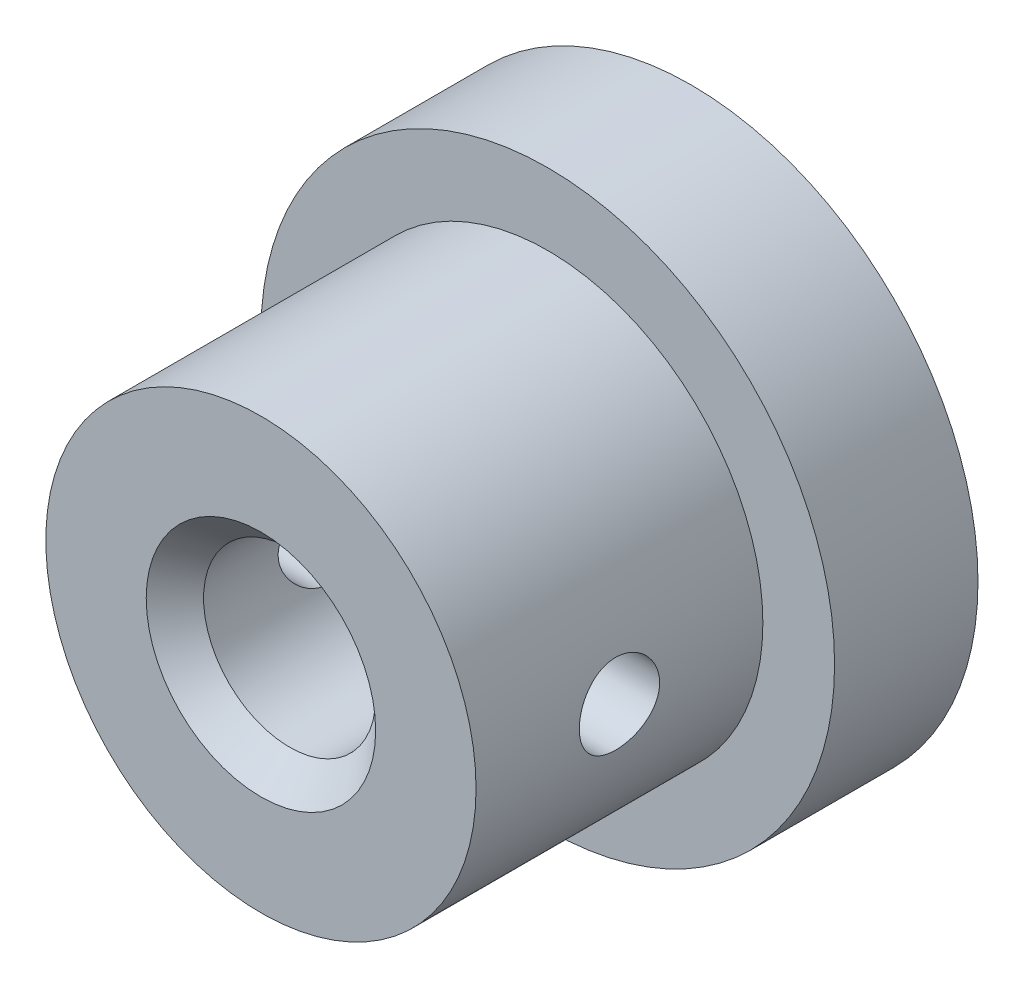
ISO-10303-21;
HEADER;
FILE_DESCRIPTION(('STEP AP214'),'2;1');
FILE_NAME('part.step','',(''),(''),'','','');
FILE_SCHEMA(('AUTOMOTIVE_DESIGN { 1 0 10303 214 1 1 1 1 }'));
ENDSEC;
DATA;
#1=APPLICATION_CONTEXT('core data for automotive mechanical design processes');
#2=APPLICATION_PROTOCOL_DEFINITION('international standard','automotive_design',2000,#1);
#3=PRODUCT_CONTEXT('',#1,'mechanical');
#4=PRODUCT('Part','Part','',(#3));
#5=PRODUCT_RELATED_PRODUCT_CATEGORY('part','',(#4));
#6=PRODUCT_DEFINITION_FORMATION('','',#4);
#7=PRODUCT_DEFINITION_CONTEXT('part definition',#1,'design');
#8=PRODUCT_DEFINITION('design','',#6,#7);
#9=PRODUCT_DEFINITION_SHAPE('','',#8);
#10=(LENGTH_UNIT() NAMED_UNIT(*) SI_UNIT(.MILLI.,.METRE.));
#11=(NAMED_UNIT(*) PLANE_ANGLE_UNIT() SI_UNIT($,.RADIAN.));
#12=(NAMED_UNIT(*) SI_UNIT($,.STERADIAN.) SOLID_ANGLE_UNIT());
#13=UNCERTAINTY_MEASURE_WITH_UNIT(LENGTH_MEASURE(1.E-05),#10,'distance_accuracy_value','');
#14=(GEOMETRIC_REPRESENTATION_CONTEXT(3) GLOBAL_UNCERTAINTY_ASSIGNED_CONTEXT((#13)) GLOBAL_UNIT_ASSIGNED_CONTEXT((#10,
#11,#12)) REPRESENTATION_CONTEXT('',''));
#15=CARTESIAN_POINT('',(0.,0.,0.));
#16=DIRECTION('',(0.,0.,1.));
#17=DIRECTION('',(1.,0.,0.));
#18=AXIS2_PLACEMENT_3D('',#15,#16,#17);
#19=CARTESIAN_POINT('',(0.,0.,15.));
#20=DIRECTION('',(0.,0.,-1.));
#21=DIRECTION('',(-1.,0.,0.));
#22=AXIS2_PLACEMENT_3D('',#19,#20,#21);
#23=CYLINDRICAL_SURFACE('',#22,3.);
#24=CARTESIAN_POINT('',(0.,0.,14.));
#25=DIRECTION('',(0.,0.,1.));
#26=DIRECTION('',(1.,0.,0.));
#27=AXIS2_PLACEMENT_3D('',#24,#25,#26);
#28=CIRCLE('',#27,3.);
#29=CARTESIAN_POINT('',(3.,0.,14.));
#30=VERTEX_POINT('',#29);
#31=EDGE_CURVE('E44',#30,#30,#28,.T.);
#32=ORIENTED_EDGE('',*,*,#31,.T.);
#33=EDGE_LOOP('',(#32));
#34=FACE_BOUND('',#33,.T.);
#35=CARTESIAN_POINT('',(0.,0.,0.999999999999996));
#36=DIRECTION('',(0.,0.,1.));
#37=DIRECTION('',(1.,0.,0.));
#38=AXIS2_PLACEMENT_3D('',#35,#36,#37);
#39=CIRCLE('',#38,3.);
#40=CARTESIAN_POINT('',(3.,0.,0.999999999999996));
#41=VERTEX_POINT('',#40);
#42=EDGE_CURVE('E48',#41,#41,#39,.F.);
#43=ORIENTED_EDGE('',*,*,#42,.T.);
#44=EDGE_LOOP('',(#43));
#45=FACE_BOUND('',#44,.T.);
#46=CARTESIAN_POINT('',(-3.,0.,11.4));
#47=CARTESIAN_POINT('',(-2.9999965985567,-0.0741760141958528,11.3999959494459));
#48=CARTESIAN_POINT('',(-2.99721866421499,-0.148457438343158,11.3940701791647));
#49=CARTESIAN_POINT('',(-2.98638133101226,-0.294860958042638,11.3706122407267));
#50=CARTESIAN_POINT('',(-2.97831023303417,-0.36697789948566,11.353054362039));
#51=CARTESIAN_POINT('',(-2.95773878056305,-0.506705207958353,11.3071482448661));
#52=CARTESIAN_POINT('',(-2.94525483671525,-0.574331184032726,11.2788399567657));
#53=CARTESIAN_POINT('',(-2.91703179641225,-0.703790652559755,11.2124256993013));
#54=CARTESIAN_POINT('',(-2.90129324579851,-0.765625113804206,11.1743213726048));
#55=CARTESIAN_POINT('',(-2.86703510505487,-0.885556018232678,11.0870093163225));
#56=CARTESIAN_POINT('',(-2.84841047078529,-0.943262854198594,11.0373081607334));
#57=CARTESIAN_POINT('',(-2.81086626705386,-1.04987206669058,10.9292658128459));
#58=CARTESIAN_POINT('',(-2.79194651225135,-1.09876864666266,10.8709189779387));
#59=CARTESIAN_POINT('',(-2.75454886272565,-1.18954928643585,10.7426563277008));
#60=CARTESIAN_POINT('',(-2.73618026181933,-1.23076801131511,10.6722341734925));
#61=CARTESIAN_POINT('',(-2.70368671328044,-1.30060459631541,10.5244916658338));
#62=CARTESIAN_POINT('',(-2.68955905843085,-1.32923050054668,10.447175754093));
#63=CARTESIAN_POINT('',(-2.66831280778357,-1.37136389166292,10.2922913308142));
#64=CARTESIAN_POINT('',(-2.66084688805232,-1.38562630954338,10.2149779866021));
#65=CARTESIAN_POINT('',(-2.65280653141493,-1.4009643178012,10.0587238445313));
#66=CARTESIAN_POINT('',(-2.65222672171534,-1.40205018901381,9.97978436362684));
#67=CARTESIAN_POINT('',(-2.6577381391041,-1.39156325474428,9.83104782259268));
#68=CARTESIAN_POINT('',(-2.66316277668237,-1.38125548710099,9.76113132367479));
#69=CARTESIAN_POINT('',(-2.67892103840313,-1.35043639237287,9.62416592160718));
#70=CARTESIAN_POINT('',(-2.68925592410991,-1.32992244300339,9.55711776023274));
#71=CARTESIAN_POINT('',(-2.71390923378543,-1.27887161255287,9.42592780866886));
#72=CARTESIAN_POINT('',(-2.7283140240837,-1.24811450695909,9.36188869599852));
#73=CARTESIAN_POINT('',(-2.75947702819645,-1.17761205733664,9.23959400364931));
#74=CARTESIAN_POINT('',(-2.77623626923161,-1.13786278548149,9.18134096740935));
#75=CARTESIAN_POINT('',(-2.81242518177222,-1.04545769592097,9.06561325724133));
#76=CARTESIAN_POINT('',(-2.83194722846672,-0.991869135627384,9.00890981132952));
#77=CARTESIAN_POINT('',(-2.86996272516678,-0.875809338201001,8.90499883889947));
#78=CARTESIAN_POINT('',(-2.88845579691007,-0.813334864133947,8.85779478799144));
#79=CARTESIAN_POINT('',(-2.92314231667083,-0.678420066791913,8.77267474199008));
#80=CARTESIAN_POINT('',(-2.9392303997136,-0.605704043903012,8.73514943953424));
#81=CARTESIAN_POINT('',(-2.9664385628126,-0.454047875045108,8.67314728148889));
#82=CARTESIAN_POINT('',(-2.97756209480586,-0.375112098848908,8.64866135710182));
#83=CARTESIAN_POINT('',(-2.99289168727817,-0.219630179590067,8.61522461451369));
#84=CARTESIAN_POINT('',(-2.99755511855446,-0.143350867486892,8.60524384224663));
#85=CARTESIAN_POINT('',(-3.00096130674055,0.0099315960306232,8.59793666008045));
#86=CARTESIAN_POINT('',(-2.99970636153703,0.0869344549310015,8.60060533886939));
#87=CARTESIAN_POINT('',(-2.99169876992405,0.234138662301143,8.61785977225628));
#88=CARTESIAN_POINT('',(-2.98531143610107,0.304455247280259,8.63165387927403));
#89=CARTESIAN_POINT('',(-2.9681169868393,0.441661374952194,8.66958529647006));
#90=CARTESIAN_POINT('',(-2.95730935403885,0.508550515457679,8.69372381739748));
#91=CARTESIAN_POINT('',(-2.93186182190093,0.639346310572955,8.75238939988832));
#92=CARTESIAN_POINT('',(-2.91711463217099,0.703098749779364,8.78721214998557));
#93=CARTESIAN_POINT('',(-2.88527461622476,0.824081336424184,8.86593442705303));
#94=CARTESIAN_POINT('',(-2.86818076040266,0.881308600637788,8.90983794254021));
#95=CARTESIAN_POINT('',(-2.83157928041133,0.992927203863402,9.00995057808187));
#96=CARTESIAN_POINT('',(-2.81199150907127,1.04662821994276,9.06690174669527));
#97=CARTESIAN_POINT('',(-2.77381712049361,1.14397488618523,9.18917794714694));
#98=CARTESIAN_POINT('',(-2.7552309844915,1.18761573536872,9.25450695406383));
#99=CARTESIAN_POINT('',(-2.72065279755535,1.26487258942863,9.3944537387633));
#100=CARTESIAN_POINT('',(-2.70476441122083,1.29811762077689,9.4693040329686));
#101=CARTESIAN_POINT('',(-2.67864935946574,1.35119476914698,9.62452606229619));
#102=CARTESIAN_POINT('',(-2.6684164320798,1.37104172650418,9.70489157939703));
#103=CARTESIAN_POINT('',(-2.65589863089785,1.39512361569359,9.86107554771441));
#104=CARTESIAN_POINT('',(-2.65298045006346,1.40060458275625,9.93665086073106));
#105=CARTESIAN_POINT('',(-2.65367487263324,1.39928993042139,10.08765382327));
#106=CARTESIAN_POINT('',(-2.65728564169681,1.39249775922279,10.1630815083089));
#107=CARTESIAN_POINT('',(-2.66999487603889,1.36795238910771,10.3059000624837));
#108=CARTESIAN_POINT('',(-2.67867409395688,1.35103435582631,10.3734759592958));
#109=CARTESIAN_POINT('',(-2.70011439829818,1.30765598987226,10.5047982846028));
#110=CARTESIAN_POINT('',(-2.71287670048705,1.28119281477063,10.5685435657827));
#111=CARTESIAN_POINT('',(-2.74208602331761,1.21748406199402,10.6950365450524));
#112=CARTESIAN_POINT('',(-2.75872111955289,1.1796403806501,10.7574384776214));
#113=CARTESIAN_POINT('',(-2.79340714138716,1.0949742620724,10.8753898144412));
#114=CARTESIAN_POINT('',(-2.81145872568485,1.04814763276814,10.9309359993539));
#115=CARTESIAN_POINT('',(-2.8491150891186,0.94130768052003,11.0393736199957));
#116=CARTESIAN_POINT('',(-2.86869394428718,0.880442612871033,11.0914392587178));
#117=CARTESIAN_POINT('',(-2.90547332461736,0.750199086477078,11.1847434328512));
#118=CARTESIAN_POINT('',(-2.92267271652822,0.680816600685454,11.2259768176048));
#119=CARTESIAN_POINT('',(-2.95272548252543,0.535611024288785,11.2959874979833));
#120=CARTESIAN_POINT('',(-2.96560157678301,0.45982430997794,11.3248301416636));
#121=CARTESIAN_POINT('',(-2.98560363061672,0.303822742627248,11.3690227435493));
#122=CARTESIAN_POINT('',(-2.99274669700571,0.223621832238214,11.3844128551744));
#123=CARTESIAN_POINT('',(-2.99773444736987,0.118989792805176,11.3951390145757));
#124=CARTESIAN_POINT('',(-2.99858232619917,0.0952397688918327,11.3969599000192));
#125=CARTESIAN_POINT('',(-2.99971565466794,0.0476634596251051,11.39939105565));
#126=CARTESIAN_POINT('',(-3.00000109308639,0.0238371727597298,11.4000013016844));
#127=CARTESIAN_POINT('',(-3.,0.,11.4));
#128=B_SPLINE_CURVE_WITH_KNOTS('',3,(#46,#47,#48,#49,#50,#51,#52,#53,#54,#55,#56,#57,#58,#59,
#60,#61,#62,#63,#64,#65,#66,#67,#68,#69,#70,#71,#72,#73,#74,#75,#76,#77,#78,#79,#80,#81,#82,#83,
#84,#85,#86,#87,#88,#89,#90,#91,#92,#93,#94,#95,#96,#97,#98,#99,#100,#101,#102,#103,#104,#105,
#106,#107,#108,#109,#110,#111,#112,#113,#114,#115,#116,#117,#118,#119,#120,#121,#122,#123,#124,
#125,#126,#127),.UNSPECIFIED.,.T.,.F.,(4,2,2,2,2,2,2,2,2,2,2,2,2,2,2,2,2,2,2,2,2,2,2,2,2,2,2,2,
2,2,2,2,2,2,2,2,2,2,2,2,4),(0.,0.222430614227101,0.445354516020343,0.667457974459496,
0.88952421331948,1.12374008349083,1.3581094936473,1.60776429290693,1.8572593839249,
2.09282314699248,2.32820310256043,2.53985531348055,2.75156193252273,2.96815060600377,
3.18483406988205,3.42504393482463,3.66534152788207,3.91419776760519,4.16288070273416,
4.392858842168,4.62274769694934,4.83758576938904,5.05244899415581,5.27389671638203,
5.49544191175845,5.73644174754947,5.97755635787823,6.22648976232309,6.47514698203737,
6.70138965858241,6.92756878101077,7.13725924988263,7.34701221368888,7.57065894835865,
7.79441030722339,8.0406156991707,8.28693794895593,8.53194466707524,8.77621756163929,
8.84769634435319,8.91917655309539),.UNSPECIFIED.);
#129=CARTESIAN_POINT('',(-3.,0.,11.4));
#130=VERTEX_POINT('',#129);
#131=EDGE_CURVE('E87',#130,#130,#128,.T.);
#132=ORIENTED_EDGE('',*,*,#131,.F.);
#133=EDGE_LOOP('',(#132));
#134=FACE_BOUND('',#133,.T.);
#135=CARTESIAN_POINT('',(3.,0.,8.6));
#136=CARTESIAN_POINT('',(2.99999659855669,-0.0741760141958545,8.60000405055413));
#137=CARTESIAN_POINT('',(2.99721866421499,-0.14845743834316,8.60592982083528));
#138=CARTESIAN_POINT('',(2.98638133101227,-0.294860958042641,8.62938775927335));
#139=CARTESIAN_POINT('',(2.97831023303417,-0.366977899485663,8.64694563796098));
#140=CARTESIAN_POINT('',(2.95773878056305,-0.506705207958356,8.69285175513389));
#141=CARTESIAN_POINT('',(2.94525483671525,-0.574331184032728,8.72116004323428));
#142=CARTESIAN_POINT('',(2.91703179641225,-0.703790652559757,8.7875743006987));
#143=CARTESIAN_POINT('',(2.90129324579851,-0.765625113804209,8.82567862739521));
#144=CARTESIAN_POINT('',(2.86703510505487,-0.885556018232681,8.91299068367755));
#145=CARTESIAN_POINT('',(2.84841047078529,-0.943262854198598,8.96269183926658));
#146=CARTESIAN_POINT('',(2.81086626705385,-1.04987206669058,9.07073418715406));
#147=CARTESIAN_POINT('',(2.79194651225135,-1.09876864666266,9.12908102206132));
#148=CARTESIAN_POINT('',(2.75454886272565,-1.18954928643585,9.25734367229923));
#149=CARTESIAN_POINT('',(2.73618026181933,-1.23076801131511,9.32776582650748));
#150=CARTESIAN_POINT('',(2.70368671328043,-1.30060459631542,9.47550833416622));
#151=CARTESIAN_POINT('',(2.68955905843085,-1.32923050054668,9.55282424590696));
#152=CARTESIAN_POINT('',(2.66831280778357,-1.37136389166292,9.7077086691858));
#153=CARTESIAN_POINT('',(2.66084688805232,-1.38562630954338,9.78502201339795));
#154=CARTESIAN_POINT('',(2.65280653141493,-1.4009643178012,9.9412761554687));
#155=CARTESIAN_POINT('',(2.65222672171534,-1.40205018901381,10.0202156363732));
#156=CARTESIAN_POINT('',(2.6577381391041,-1.39156325474428,10.1689521774073));
#157=CARTESIAN_POINT('',(2.66316277668237,-1.38125548710099,10.2388686763252));
#158=CARTESIAN_POINT('',(2.67892103840313,-1.35043639237287,10.3758340783928));
#159=CARTESIAN_POINT('',(2.68925592410991,-1.32992244300339,10.4428822397673));
#160=CARTESIAN_POINT('',(2.71390923378543,-1.27887161255287,10.5740721913311));
#161=CARTESIAN_POINT('',(2.7283140240837,-1.24811450695909,10.6381113040015));
#162=CARTESIAN_POINT('',(2.75947702819645,-1.17761205733664,10.7604059963507));
#163=CARTESIAN_POINT('',(2.77623626923161,-1.13786278548149,10.8186590325906));
#164=CARTESIAN_POINT('',(2.81242518177222,-1.04545769592097,10.9343867427587));
#165=CARTESIAN_POINT('',(2.83194722846672,-0.991869135627384,10.9910901886705));
#166=CARTESIAN_POINT('',(2.86996272516678,-0.875809338201001,11.0950011611005));
#167=CARTESIAN_POINT('',(2.88845579691007,-0.813334864133949,11.1422052120086));
#168=CARTESIAN_POINT('',(2.92314231667083,-0.678420066791914,11.2273252580099));
#169=CARTESIAN_POINT('',(2.9392303997136,-0.605704043903012,11.2648505604658));
#170=CARTESIAN_POINT('',(2.9664385628126,-0.454047875045108,11.3268527185111));
#171=CARTESIAN_POINT('',(2.97756209480586,-0.375112098848906,11.3513386428982));
#172=CARTESIAN_POINT('',(2.99289168727817,-0.219630179590064,11.3847753854863));
#173=CARTESIAN_POINT('',(2.99755511855446,-0.143350867486889,11.3947561577534));
#174=CARTESIAN_POINT('',(3.00096130674055,0.00993159603062563,11.4020633399195));
#175=CARTESIAN_POINT('',(2.99970636153703,0.0869344549310039,11.3993946611306));
#176=CARTESIAN_POINT('',(2.99169876992405,0.234138662301146,11.3821402277437));
#177=CARTESIAN_POINT('',(2.98531143610107,0.304455247280262,11.368346120726));
#178=CARTESIAN_POINT('',(2.9681169868393,0.441661374952197,11.3304147035299));
#179=CARTESIAN_POINT('',(2.95730935403885,0.508550515457683,11.3062761826025));
#180=CARTESIAN_POINT('',(2.93186182190092,0.639346310572959,11.2476106001117));
#181=CARTESIAN_POINT('',(2.91711463217098,0.703098749779368,11.2127878500144));
#182=CARTESIAN_POINT('',(2.88527461622476,0.824081336424188,11.134065572947));
#183=CARTESIAN_POINT('',(2.86818076040266,0.881308600637793,11.0901620574598));
#184=CARTESIAN_POINT('',(2.83157928041133,0.992927203863407,10.9900494219181));
#185=CARTESIAN_POINT('',(2.81199150907127,1.04662821994276,10.9330982533047));
#186=CARTESIAN_POINT('',(2.7738171204936,1.14397488618524,10.8108220528531));
#187=CARTESIAN_POINT('',(2.7552309844915,1.18761573536873,10.7454930459362));
#188=CARTESIAN_POINT('',(2.72065279755534,1.26487258942864,10.6055462612367));
#189=CARTESIAN_POINT('',(2.70476441122083,1.29811762077689,10.5306959670314));
#190=CARTESIAN_POINT('',(2.67864935946574,1.35119476914698,10.3754739377038));
#191=CARTESIAN_POINT('',(2.6684164320798,1.37104172650418,10.295108420603));
#192=CARTESIAN_POINT('',(2.65589863089785,1.39512361569359,10.1389244522856));
#193=CARTESIAN_POINT('',(2.65298045006346,1.40060458275625,10.0633491392689));
#194=CARTESIAN_POINT('',(2.65367487263324,1.39928993042139,9.91234617672999));
#195=CARTESIAN_POINT('',(2.65728564169682,1.39249775922279,9.8369184916911));
#196=CARTESIAN_POINT('',(2.66999487603889,1.36795238910771,9.69409993751634));
#197=CARTESIAN_POINT('',(2.67867409395688,1.35103435582631,9.62652404070422));
#198=CARTESIAN_POINT('',(2.70011439829818,1.30765598987226,9.4952017153972));
#199=CARTESIAN_POINT('',(2.71287670048705,1.28119281477063,9.43145643421729));
#200=CARTESIAN_POINT('',(2.74208602331761,1.21748406199402,9.3049634549476));
#201=CARTESIAN_POINT('',(2.75872111955289,1.1796403806501,9.24256152237859));
#202=CARTESIAN_POINT('',(2.79340714138716,1.0949742620724,9.12461018555875));
#203=CARTESIAN_POINT('',(2.81145872568485,1.04814763276814,9.06906400064614));
#204=CARTESIAN_POINT('',(2.8491150891186,0.94130768052003,8.96062638000433));
#205=CARTESIAN_POINT('',(2.86869394428718,0.880442612871033,8.9085607412822));
#206=CARTESIAN_POINT('',(2.90547332461736,0.750199086477078,8.81525656714877));
#207=CARTESIAN_POINT('',(2.92267271652822,0.680816600685454,8.77402318239517));
#208=CARTESIAN_POINT('',(2.95272548252543,0.535611024288786,8.70401250201674));
#209=CARTESIAN_POINT('',(2.96560157678301,0.45982430997794,8.67516985833644));
#210=CARTESIAN_POINT('',(2.98560363061672,0.303822742627247,8.63097725645068));
#211=CARTESIAN_POINT('',(2.99274669700571,0.223621832238214,8.61558714482558));
#212=CARTESIAN_POINT('',(2.99773444736987,0.118989792805175,8.60486098542432));
#213=CARTESIAN_POINT('',(2.99858232619917,0.0952397688918304,8.60304009998084));
#214=CARTESIAN_POINT('',(2.99971565466794,0.0476634596251028,8.60060894435001));
#215=CARTESIAN_POINT('',(3.00000109308639,0.023837172759728,8.59999869831563));
#216=CARTESIAN_POINT('',(3.,0.,8.6));
#217=B_SPLINE_CURVE_WITH_KNOTS('',3,(#135,#136,#137,#138,#139,#140,#141,#142,#143,#144,#145,
#146,#147,#148,#149,#150,#151,#152,#153,#154,#155,#156,#157,#158,#159,#160,#161,#162,#163,#164,
#165,#166,#167,#168,#169,#170,#171,#172,#173,#174,#175,#176,#177,#178,#179,#180,#181,#182,#183,
#184,#185,#186,#187,#188,#189,#190,#191,#192,#193,#194,#195,#196,#197,#198,#199,#200,#201,#202,
#203,#204,#205,#206,#207,#208,#209,#210,#211,#212,#213,#214,#215,#216),.UNSPECIFIED.,.T.,.F.,(4,
2,2,2,2,2,2,2,2,2,2,2,2,2,2,2,2,2,2,2,2,2,2,2,2,2,2,2,2,2,2,2,2,2,2,2,2,2,2,2,4),(0.,
0.222430614227102,0.445354516020345,0.667457974459496,0.889524213319484,1.12374008349084,
1.3581094936473,1.60776429290694,1.8572593839249,2.09282314699248,2.32820310256044,
2.53985531348055,2.75156193252273,2.96815060600377,3.18483406988205,3.42504393482463,
3.66534152788206,3.91419776760519,4.16288070273416,4.392858842168,4.62274769694934,
4.83758576938904,5.05244899415581,5.27389671638204,5.49544191175845,5.73644174754948,
5.97755635787824,6.2264897623231,6.47514698203737,6.70138965858241,6.92756878101077,
7.13725924988263,7.34701221368888,7.57065894835865,7.79441030722339,8.0406156991707,
8.28693794895593,8.53194466707524,8.77621756163929,8.84769634435319,8.91917655309539),.UNSPECIFIED.);
#218=CARTESIAN_POINT('',(3.,0.,8.6));
#219=VERTEX_POINT('',#218);
#220=EDGE_CURVE('E61',#219,#219,#217,.T.);
#221=ORIENTED_EDGE('',*,*,#220,.F.);
#222=EDGE_LOOP('',(#221));
#223=FACE_BOUND('',#222,.T.);
#224=ADVANCED_FACE('F33',(#34,#45,#134,#223),#23,.F.);
#225=CARTESIAN_POINT('',(0.,0.,15.));
#226=DIRECTION('',(0.,0.,-1.));
#227=DIRECTION('',(-1.,0.,0.));
#228=AXIS2_PLACEMENT_3D('',#225,#226,#227);
#229=CYLINDRICAL_SURFACE('',#228,7.5);
#230=CARTESIAN_POINT('',(-7.5,0.,11.4));
#231=CARTESIAN_POINT('',(-7.49999859125424,-0.077913367410951,11.3999970160642));
#232=CARTESIAN_POINT('',(-7.49877336135813,-0.155865631728099,11.3934739224129));
#233=CARTESIAN_POINT('',(-7.49400376714503,-0.309573945210474,11.3675704477317));
#234=CARTESIAN_POINT('',(-7.4904574381938,-0.385328077045563,11.3481791745706));
#235=CARTESIAN_POINT('',(-7.48144239226834,-0.532394902616652,11.2971534207424));
#236=CARTESIAN_POINT('',(-7.47597540497422,-0.603711524827169,11.2655299533969));
#237=CARTESIAN_POINT('',(-7.46371620380283,-0.740020082945072,11.1909686454306));
#238=CARTESIAN_POINT('',(-7.45692409905732,-0.805012539027139,11.148031736441));
#239=CARTESIAN_POINT('',(-7.44267430493776,-0.927606272698272,11.0515211104182));
#240=CARTESIAN_POINT('',(-7.43521030529913,-0.98512159456748,10.9978391275889));
#241=CARTESIAN_POINT('',(-7.42050485674198,-1.09038485665154,10.8815950880803));
#242=CARTESIAN_POINT('',(-7.41326342375634,-1.13813209897619,10.8190323974505));
#243=CARTESIAN_POINT('',(-7.3997616811699,-1.22286079770395,10.6861961249087));
#244=CARTESIAN_POINT('',(-7.3935095083739,-1.25975491870461,10.6158659369164));
#245=CARTESIAN_POINT('',(-7.38278303352665,-1.32117102449928,10.4698694249167));
#246=CARTESIAN_POINT('',(-7.37830857958388,-1.34569406634903,10.3942035574503));
#247=CARTESIAN_POINT('',(-7.37170763757229,-1.38139624396322,10.2406029239261));
#248=CARTESIAN_POINT('',(-7.36955480490632,-1.39272521996421,10.1627041405356));
#249=CARTESIAN_POINT('',(-7.36776141784466,-1.4021827516858,10.0060839816734));
#250=CARTESIAN_POINT('',(-7.36812064017918,-1.40031248054661,9.92736267992762));
#251=CARTESIAN_POINT('',(-7.37128678738226,-1.38354613242022,9.77241699846971));
#252=CARTESIAN_POINT('',(-7.37406170969313,-1.36882035466186,9.69617344056424));
#253=CARTESIAN_POINT('',(-7.38169633260816,-1.3270291603155,9.54725839154639));
#254=CARTESIAN_POINT('',(-7.38655612108845,-1.29996322359251,9.47458705114524));
#255=CARTESIAN_POINT('',(-7.39784640181638,-1.23409321060501,9.33438053732231));
#256=CARTESIAN_POINT('',(-7.40428606278954,-1.1952202876869,9.26687847735336));
#257=CARTESIAN_POINT('',(-7.41800442531871,-1.10688846048193,9.13929113271793));
#258=CARTESIAN_POINT('',(-7.4252832112634,-1.05742849105322,9.0792065952735));
#259=CARTESIAN_POINT('',(-7.43999918071803,-0.948407971698381,8.96717585534892));
#260=CARTESIAN_POINT('',(-7.4474370626664,-0.88870174033024,8.91537140740493));
#261=CARTESIAN_POINT('',(-7.46152866848707,-0.761371236571214,8.82249261726087));
#262=CARTESIAN_POINT('',(-7.46818238462862,-0.693746886132021,8.78141838084058));
#263=CARTESIAN_POINT('',(-7.47996921746132,-0.552352497236689,8.71114541179937));
#264=CARTESIAN_POINT('',(-7.48510045620092,-0.478575011433201,8.68196132908119));
#265=CARTESIAN_POINT('',(-7.49324964825403,-0.327047822563484,8.63643992209997));
#266=CARTESIAN_POINT('',(-7.49626782403512,-0.249298538581316,8.62010124542414));
#267=CARTESIAN_POINT('',(-7.49982029245223,-0.093254429656115,8.60093153725318));
#268=CARTESIAN_POINT('',(-7.50039030063849,-0.0149842535036387,8.5979062644765));
#269=CARTESIAN_POINT('',(-7.49908083147953,0.140943599366158,8.60492834119282));
#270=CARTESIAN_POINT('',(-7.49720147337103,0.218601305713756,8.61497505433319));
#271=CARTESIAN_POINT('',(-7.4912266743448,0.370484374990086,8.64769441976653));
#272=CARTESIAN_POINT('',(-7.48714847562436,0.444731629242857,8.6702688756202));
#273=CARTESIAN_POINT('',(-7.47723139159912,0.588387527084435,8.72729672386629));
#274=CARTESIAN_POINT('',(-7.47139238758289,0.657795844049149,8.76175091719927));
#275=CARTESIAN_POINT('',(-7.45851229738673,0.790633213102287,8.84199075585914));
#276=CARTESIAN_POINT('',(-7.45145886519141,0.853989283234831,8.88789520092187));
#277=CARTESIAN_POINT('',(-7.43696439317826,0.972168673464302,8.989571615031));
#278=CARTESIAN_POINT('',(-7.42952331755519,1.02699120347712,9.04534449673364));
#279=CARTESIAN_POINT('',(-7.41497385349456,1.12728462577657,9.16605362487332));
#280=CARTESIAN_POINT('',(-7.40787112903525,1.17262301470251,9.23110076030566));
#281=CARTESIAN_POINT('',(-7.39491622090559,1.25172982219397,9.36800191216051));
#282=CARTESIAN_POINT('',(-7.3890639910189,1.28549866837976,9.43985567687881));
#283=CARTESIAN_POINT('',(-7.37931705682305,1.34031952638564,9.58799260560827));
#284=CARTESIAN_POINT('',(-7.3754129858809,1.36143248761535,9.66425256908969));
#285=CARTESIAN_POINT('',(-7.36998291741041,1.390530388651,9.81931706000609));
#286=CARTESIAN_POINT('',(-7.36845665423389,1.39851679495834,9.89812130219057));
#287=CARTESIAN_POINT('',(-7.36796839970978,1.40108615188244,10.054710312043));
#288=CARTESIAN_POINT('',(-7.36896642490907,1.39587809397871,10.1324916027113));
#289=CARTESIAN_POINT('',(-7.37332567909415,1.37266367637821,10.2860492743761));
#290=CARTESIAN_POINT('',(-7.37668689425856,1.35465739153333,10.3618256670958));
#291=CARTESIAN_POINT('',(-7.38537703463725,1.30644549635851,10.5091114355996));
#292=CARTESIAN_POINT('',(-7.3907023393549,1.27626232270117,10.5806283830422));
#293=CARTESIAN_POINT('',(-7.4027232291267,1.20457623641904,10.7176166029854));
#294=CARTESIAN_POINT('',(-7.40941890979242,1.16307253389003,10.7830874531849));
#295=CARTESIAN_POINT('',(-7.42355034378414,1.06919613853274,10.9071722564132));
#296=CARTESIAN_POINT('',(-7.43099560595939,1.01667127704805,10.965670022843));
#297=CARTESIAN_POINT('',(-7.44571597358462,0.902561011125131,11.0730912246273));
#298=CARTESIAN_POINT('',(-7.45299103954952,0.840973527873773,11.1220124572702));
#299=CARTESIAN_POINT('',(-7.46662732048264,0.70982892852024,11.209298815218));
#300=CARTESIAN_POINT('',(-7.47297981403672,0.640205682766073,11.2475659859839));
#301=CARTESIAN_POINT('',(-7.48397004795432,0.495422278764189,11.3117990037033));
#302=CARTESIAN_POINT('',(-7.4886094021508,0.420267411958568,11.3377764345128));
#303=CARTESIAN_POINT('',(-7.49470196694218,0.28740712601829,11.3714026698424));
#304=CARTESIAN_POINT('',(-7.49667753456189,0.230479630074964,11.3821083896768));
#305=CARTESIAN_POINT('',(-7.499327057923,0.115708559017359,11.3964080737876));
#306=CARTESIAN_POINT('',(-7.50000104625286,0.0578650068755159,11.4000022161212));
#307=CARTESIAN_POINT('',(-7.5,0.,11.4));
#308=B_SPLINE_CURVE_WITH_KNOTS('',3,(#230,#231,#232,#233,#234,#235,#236,#237,#238,#239,#240,
#241,#242,#243,#244,#245,#246,#247,#248,#249,#250,#251,#252,#253,#254,#255,#256,#257,#258,#259,
#260,#261,#262,#263,#264,#265,#266,#267,#268,#269,#270,#271,#272,#273,#274,#275,#276,#277,#278,
#279,#280,#281,#282,#283,#284,#285,#286,#287,#288,#289,#290,#291,#292,#293,#294,#295,#296,#297,
#298,#299,#300,#301,#302,#303,#304,#305,#306,#307),.UNSPECIFIED.,.T.,.F.,(4,2,2,2,2,2,2,2,2,2,2,
2,2,2,2,2,2,2,2,2,2,2,2,2,2,2,2,2,2,2,2,2,2,2,2,2,2,2,4),(0.,0.233528490493101,
0.467254901205796,0.700771363087734,0.934268601532525,1.17024907459718,1.40624640163874,
1.64409388270997,1.88192103728866,2.11702009284213,2.35209825321271,2.58410875235605,
2.81612903159522,3.04952907799128,3.28295261735168,3.52002162768159,3.75709297497979,
3.99445554179438,4.23179311483481,4.4656562257738,4.699507952533,4.93155204918363,
5.16361179347651,5.39818740209162,5.63278471616095,5.87046805589724,6.10814260970442,
6.34466315484715,6.58115727406959,6.81392898125116,7.04669932705199,7.27904272374925,
7.51140233664979,7.74721048008594,7.98307279850994,8.22103697750464,8.45877641114052,
8.63221861376356,8.80565647374897),.UNSPECIFIED.);
#309=CARTESIAN_POINT('',(-7.5,0.,11.4));
#310=VERTEX_POINT('',#309);
#311=EDGE_CURVE('E54',#310,#310,#308,.T.);
#312=ORIENTED_EDGE('',*,*,#311,.T.);
#313=EDGE_LOOP('',(#312));
#314=FACE_BOUND('',#313,.T.);
#315=CARTESIAN_POINT('',(7.5,0.,8.6));
#316=CARTESIAN_POINT('',(7.49999859125423,-0.0779133674109526,8.60000298393575));
#317=CARTESIAN_POINT('',(7.49877336135813,-0.155865631728101,8.60652607758706));
#318=CARTESIAN_POINT('',(7.49400376714503,-0.309573945210476,8.63242955226832));
#319=CARTESIAN_POINT('',(7.4904574381938,-0.385328077045565,8.65182082542943));
#320=CARTESIAN_POINT('',(7.48144239226834,-0.532394902616653,8.70284657925757));
#321=CARTESIAN_POINT('',(7.47597540497422,-0.60371152482717,8.7344700466031));
#322=CARTESIAN_POINT('',(7.46371620380283,-0.740020082945074,8.80903135456935));
#323=CARTESIAN_POINT('',(7.45692409905732,-0.805012539027141,8.85196826355902));
#324=CARTESIAN_POINT('',(7.44267430493776,-0.927606272698275,8.94847888958178));
#325=CARTESIAN_POINT('',(7.43521030529913,-0.985121594567482,9.00216087241111));
#326=CARTESIAN_POINT('',(7.42050485674198,-1.09038485665154,9.11840491191974));
#327=CARTESIAN_POINT('',(7.41326342375634,-1.13813209897619,9.18096760254954));
#328=CARTESIAN_POINT('',(7.3997616811699,-1.22286079770395,9.31380387509133));
#329=CARTESIAN_POINT('',(7.3935095083739,-1.25975491870461,9.38413406308365));
#330=CARTESIAN_POINT('',(7.38278303352665,-1.32117102449928,9.53013057508327));
#331=CARTESIAN_POINT('',(7.37830857958388,-1.34569406634903,9.6057964425497));
#332=CARTESIAN_POINT('',(7.37170763757229,-1.38139624396322,9.75939707607392));
#333=CARTESIAN_POINT('',(7.36955480490632,-1.39272521996421,9.83729585946439));
#334=CARTESIAN_POINT('',(7.36776141784466,-1.4021827516858,9.99391601832655));
#335=CARTESIAN_POINT('',(7.36812064017918,-1.40031248054661,10.0726373200724));
#336=CARTESIAN_POINT('',(7.37128678738226,-1.38354613242022,10.2275830015303));
#337=CARTESIAN_POINT('',(7.37406170969313,-1.36882035466186,10.3038265594358));
#338=CARTESIAN_POINT('',(7.38169633260816,-1.3270291603155,10.4527416084536));
#339=CARTESIAN_POINT('',(7.38655612108846,-1.29996322359251,10.5254129488548));
#340=CARTESIAN_POINT('',(7.39784640181638,-1.23409321060501,10.6656194626777));
#341=CARTESIAN_POINT('',(7.40428606278954,-1.1952202876869,10.7331215226466));
#342=CARTESIAN_POINT('',(7.41800442531871,-1.10688846048193,10.8607088672821));
#343=CARTESIAN_POINT('',(7.4252832112634,-1.05742849105322,10.9207934047265));
#344=CARTESIAN_POINT('',(7.43999918071803,-0.94840797169838,11.0328241446511));
#345=CARTESIAN_POINT('',(7.4474370626664,-0.888701740330239,11.0846285925951));
#346=CARTESIAN_POINT('',(7.46152866848707,-0.761371236571213,11.1775073827391));
#347=CARTESIAN_POINT('',(7.46818238462862,-0.69374688613202,11.2185816191594));
#348=CARTESIAN_POINT('',(7.47996921746132,-0.552352497236688,11.2888545882006));
#349=CARTESIAN_POINT('',(7.48510045620092,-0.4785750114332,11.3180386709188));
#350=CARTESIAN_POINT('',(7.49324964825403,-0.327047822563483,11.3635600779));
#351=CARTESIAN_POINT('',(7.49626782403512,-0.249298538581314,11.3798987545759));
#352=CARTESIAN_POINT('',(7.49982029245223,-0.0932544296561135,11.3990684627468));
#353=CARTESIAN_POINT('',(7.50039030063849,-0.0149842535036373,11.4020937355235));
#354=CARTESIAN_POINT('',(7.49908083147953,0.14094359936616,11.3950716588072));
#355=CARTESIAN_POINT('',(7.49720147337103,0.218601305713758,11.3850249456668));
#356=CARTESIAN_POINT('',(7.4912266743448,0.370484374990088,11.3523055802335));
#357=CARTESIAN_POINT('',(7.48714847562436,0.444731629242859,11.3297311243798));
#358=CARTESIAN_POINT('',(7.47723139159912,0.588387527084438,11.2727032761337));
#359=CARTESIAN_POINT('',(7.47139238758289,0.657795844049151,11.2382490828007));
#360=CARTESIAN_POINT('',(7.45851229738673,0.790633213102289,11.1580092441409));
#361=CARTESIAN_POINT('',(7.45145886519141,0.853989283234834,11.1121047990781));
#362=CARTESIAN_POINT('',(7.43696439317826,0.972168673464305,11.010428384969));
#363=CARTESIAN_POINT('',(7.42952331755519,1.02699120347712,10.9546555032664));
#364=CARTESIAN_POINT('',(7.41497385349456,1.12728462577657,10.8339463751267));
#365=CARTESIAN_POINT('',(7.40787112903525,1.17262301470251,10.7688992396943));
#366=CARTESIAN_POINT('',(7.39491622090559,1.25172982219397,10.6319980878395));
#367=CARTESIAN_POINT('',(7.3890639910189,1.28549866837976,10.5601443231212));
#368=CARTESIAN_POINT('',(7.37931705682305,1.34031952638564,10.4120073943917));
#369=CARTESIAN_POINT('',(7.3754129858809,1.36143248761536,10.3357474309103));
#370=CARTESIAN_POINT('',(7.36998291741041,1.390530388651,10.1806829399939));
#371=CARTESIAN_POINT('',(7.36845665423389,1.39851679495834,10.1018786978094));
#372=CARTESIAN_POINT('',(7.36796839970978,1.40108615188244,9.94528968795701));
#373=CARTESIAN_POINT('',(7.36896642490907,1.39587809397871,9.86750839728871));
#374=CARTESIAN_POINT('',(7.37332567909415,1.37266367637821,9.71395072562391));
#375=CARTESIAN_POINT('',(7.37668689425856,1.35465739153333,9.63817433290422));
#376=CARTESIAN_POINT('',(7.38537703463725,1.30644549635851,9.49088856440039));
#377=CARTESIAN_POINT('',(7.3907023393549,1.27626232270117,9.41937161695777));
#378=CARTESIAN_POINT('',(7.4027232291267,1.20457623641904,9.28238339701463));
#379=CARTESIAN_POINT('',(7.40941890979242,1.16307253389003,9.21691254681506));
#380=CARTESIAN_POINT('',(7.42355034378414,1.06919613853274,9.09282774358681));
#381=CARTESIAN_POINT('',(7.43099560595939,1.01667127704805,9.034329977157));
#382=CARTESIAN_POINT('',(7.44571597358462,0.902561011125132,8.92690877537267));
#383=CARTESIAN_POINT('',(7.45299103954952,0.840973527873773,8.87798754272981));
#384=CARTESIAN_POINT('',(7.46662732048264,0.709828928520239,8.79070118478202));
#385=CARTESIAN_POINT('',(7.47297981403672,0.640205682766072,8.75243401401609));
#386=CARTESIAN_POINT('',(7.48397004795432,0.495422278764189,8.68820099629674));
#387=CARTESIAN_POINT('',(7.4886094021508,0.420267411958567,8.66222356548719));
#388=CARTESIAN_POINT('',(7.49470196694218,0.287407126018289,8.62859733015755));
#389=CARTESIAN_POINT('',(7.49667753456189,0.230479630074963,8.61789161032317));
#390=CARTESIAN_POINT('',(7.499327057923,0.115708559017358,8.60359192621235));
#391=CARTESIAN_POINT('',(7.50000104625285,0.0578650068755148,8.59999778387883));
#392=CARTESIAN_POINT('',(7.5,0.,8.6));
#393=B_SPLINE_CURVE_WITH_KNOTS('',3,(#315,#316,#317,#318,#319,#320,#321,#322,#323,#324,#325,
#326,#327,#328,#329,#330,#331,#332,#333,#334,#335,#336,#337,#338,#339,#340,#341,#342,#343,#344,
#345,#346,#347,#348,#349,#350,#351,#352,#353,#354,#355,#356,#357,#358,#359,#360,#361,#362,#363,
#364,#365,#366,#367,#368,#369,#370,#371,#372,#373,#374,#375,#376,#377,#378,#379,#380,#381,#382,
#383,#384,#385,#386,#387,#388,#389,#390,#391,#392),.UNSPECIFIED.,.T.,.F.,(4,2,2,2,2,2,2,2,2,2,2,
2,2,2,2,2,2,2,2,2,2,2,2,2,2,2,2,2,2,2,2,2,2,2,2,2,2,2,4),(0.,0.233528490493102,
0.467254901205797,0.700771363087735,0.934268601532527,1.17024907459718,1.40624640163875,
1.64409388270997,1.88192103728866,2.11702009284213,2.35209825321271,2.58410875235605,
2.81612903159522,3.04952907799128,3.28295261735168,3.52002162768159,3.75709297497979,
3.99445554179438,4.23179311483481,4.4656562257738,4.699507952533,4.93155204918363,
5.16361179347651,5.39818740209162,5.63278471616095,5.87046805589724,6.10814260970442,
6.34466315484716,6.58115727406959,6.81392898125116,7.04669932705199,7.27904272374925,
7.51140233664979,7.74721048008594,7.98307279850994,8.22103697750464,8.45877641114052,
8.63221861376356,8.80565647374897),.UNSPECIFIED.);
#394=CARTESIAN_POINT('',(7.5,0.,8.6));
#395=VERTEX_POINT('',#394);
#396=EDGE_CURVE('E62',#395,#395,#393,.T.);
#397=ORIENTED_EDGE('',*,*,#396,.T.);
#398=EDGE_LOOP('',(#397));
#399=FACE_BOUND('',#398,.T.);
#400=CARTESIAN_POINT('',(0.,0.,5.));
#401=DIRECTION('',(0.,0.,1.));
#402=DIRECTION('',(1.,0.,0.));
#403=AXIS2_PLACEMENT_3D('',#400,#401,#402);
#404=CIRCLE('',#403,7.5);
#405=CARTESIAN_POINT('',(7.5,0.,5.));
#406=VERTEX_POINT('',#405);
#407=EDGE_CURVE('E123',#406,#406,#404,.T.);
#408=ORIENTED_EDGE('',*,*,#407,.T.);
#409=EDGE_LOOP('',(#408));
#410=FACE_BOUND('',#409,.T.);
#411=CARTESIAN_POINT('',(0.,0.,15.));
#412=DIRECTION('',(0.,0.,1.));
#413=DIRECTION('',(1.,0.,0.));
#414=AXIS2_PLACEMENT_3D('',#411,#412,#413);
#415=CIRCLE('',#414,7.5);
#416=CARTESIAN_POINT('',(7.5,0.,15.));
#417=VERTEX_POINT('',#416);
#418=EDGE_CURVE('E53',#417,#417,#415,.T.);
#419=ORIENTED_EDGE('',*,*,#418,.F.);
#420=EDGE_LOOP('',(#419));
#421=FACE_BOUND('',#420,.T.);
#422=ADVANCED_FACE('F66',(#314,#399,#410,#421),#229,.T.);
#423=CARTESIAN_POINT('',(0.,0.,15.));
#424=DIRECTION('',(0.,0.,1.));
#425=DIRECTION('',(1.,0.,0.));
#426=AXIS2_PLACEMENT_3D('',#423,#424,#425);
#427=PLANE('',#426);
#428=CARTESIAN_POINT('',(0.,0.,15.));
#429=DIRECTION('',(0.,0.,1.));
#430=DIRECTION('',(1.,0.,0.));
#431=AXIS2_PLACEMENT_3D('',#428,#429,#430);
#432=CIRCLE('',#431,4.);
#433=CARTESIAN_POINT('',(4.,0.,15.));
#434=VERTEX_POINT('',#433);
#435=EDGE_CURVE('E40',#434,#434,#432,.F.);
#436=ORIENTED_EDGE('',*,*,#435,.T.);
#437=EDGE_LOOP('',(#436));
#438=FACE_BOUND('',#437,.T.);
#439=ORIENTED_EDGE('',*,*,#418,.T.);
#440=EDGE_LOOP('',(#439));
#441=FACE_BOUND('',#440,.T.);
#442=ADVANCED_FACE('F118',(#438,#441),#427,.T.);
#443=CARTESIAN_POINT('',(0.,0.,0.));
#444=DIRECTION('',(0.,0.,1.));
#445=DIRECTION('',(1.,0.,0.));
#446=AXIS2_PLACEMENT_3D('',#443,#444,#445);
#447=PLANE('',#446);
#448=CARTESIAN_POINT('',(0.,0.,0.));
#449=DIRECTION('',(0.,0.,1.));
#450=DIRECTION('',(1.,0.,0.));
#451=AXIS2_PLACEMENT_3D('',#448,#449,#450);
#452=CIRCLE('',#451,3.99999999999999);
#453=CARTESIAN_POINT('',(3.99999999999999,0.,0.));
#454=VERTEX_POINT('',#453);
#455=EDGE_CURVE('E10',#454,#454,#452,.T.);
#456=ORIENTED_EDGE('',*,*,#455,.T.);
#457=EDGE_LOOP('',(#456));
#458=FACE_BOUND('',#457,.T.);
#459=CARTESIAN_POINT('',(0.,0.,0.));
#460=DIRECTION('',(0.,0.,1.));
#461=DIRECTION('',(1.,0.,0.));
#462=AXIS2_PLACEMENT_3D('',#459,#460,#461);
#463=CIRCLE('',#462,10.);
#464=CARTESIAN_POINT('',(10.,0.,0.));
#465=VERTEX_POINT('',#464);
#466=EDGE_CURVE('E131',#465,#465,#463,.T.);
#467=ORIENTED_EDGE('',*,*,#466,.F.);
#468=EDGE_LOOP('',(#467));
#469=FACE_BOUND('',#468,.T.);
#470=ADVANCED_FACE('F139',(#458,#469),#447,.F.);
#471=CARTESIAN_POINT('',(0.,0.,5.));
#472=DIRECTION('',(0.,0.,-1.));
#473=DIRECTION('',(-1.,0.,0.));
#474=AXIS2_PLACEMENT_3D('',#471,#472,#473);
#475=CYLINDRICAL_SURFACE('',#474,10.);
#476=CARTESIAN_POINT('',(0.,0.,5.));
#477=DIRECTION('',(0.,0.,1.));
#478=DIRECTION('',(1.,0.,0.));
#479=AXIS2_PLACEMENT_3D('',#476,#477,#478);
#480=CIRCLE('',#479,10.);
#481=CARTESIAN_POINT('',(10.,0.,5.));
#482=VERTEX_POINT('',#481);
#483=EDGE_CURVE('E127',#482,#482,#480,.T.);
#484=ORIENTED_EDGE('',*,*,#483,.F.);
#485=EDGE_LOOP('',(#484));
#486=FACE_BOUND('',#485,.T.);
#487=ORIENTED_EDGE('',*,*,#466,.T.);
#488=EDGE_LOOP('',(#487));
#489=FACE_BOUND('',#488,.T.);
#490=ADVANCED_FACE('F137',(#486,#489),#475,.T.);
#491=CARTESIAN_POINT('',(0.,0.,5.));
#492=DIRECTION('',(0.,0.,1.));
#493=DIRECTION('',(1.,0.,0.));
#494=AXIS2_PLACEMENT_3D('',#491,#492,#493);
#495=PLANE('',#494);
#496=ORIENTED_EDGE('',*,*,#407,.F.);
#497=EDGE_LOOP('',(#496));
#498=FACE_BOUND('',#497,.T.);
#499=ORIENTED_EDGE('',*,*,#483,.T.);
#500=EDGE_LOOP('',(#499));
#501=FACE_BOUND('',#500,.T.);
#502=ADVANCED_FACE('F77',(#498,#501),#495,.T.);
#503=CARTESIAN_POINT('',(-22.5,0.,10.));
#504=DIRECTION('',(1.,0.,0.));
#505=DIRECTION('',(0.,0.,-1.));
#506=AXIS2_PLACEMENT_3D('',#503,#504,#505);
#507=CYLINDRICAL_SURFACE('',#506,1.4);
#508=ORIENTED_EDGE('',*,*,#220,.T.);
#509=EDGE_LOOP('',(#508));
#510=FACE_BOUND('',#509,.T.);
#511=ORIENTED_EDGE('',*,*,#396,.F.);
#512=EDGE_LOOP('',(#511));
#513=FACE_BOUND('',#512,.T.);
#514=ADVANCED_FACE('F75',(#510,#513),#507,.F.);
#515=ORIENTED_EDGE('',*,*,#131,.T.);
#516=EDGE_LOOP('',(#515));
#517=FACE_BOUND('',#516,.T.);
#518=ORIENTED_EDGE('',*,*,#311,.F.);
#519=EDGE_LOOP('',(#518));
#520=FACE_BOUND('',#519,.T.);
#521=ADVANCED_FACE('F70',(#517,#520),#507,.F.);
#522=CARTESIAN_POINT('',(0.,0.,14.));
#523=DIRECTION('',(0.,0.,1.));
#524=DIRECTION('',(1.,0.,0.));
#525=AXIS2_PLACEMENT_3D('',#522,#523,#524);
#526=CONICAL_SURFACE('',#525,3.,0.785398163397451);
#527=ORIENTED_EDGE('',*,*,#435,.F.);
#528=EDGE_LOOP('',(#527));
#529=FACE_BOUND('',#528,.T.);
#530=ORIENTED_EDGE('',*,*,#31,.F.);
#531=EDGE_LOOP('',(#530));
#532=FACE_BOUND('',#531,.T.);
#533=ADVANCED_FACE('F74',(#529,#532),#526,.F.);
#534=CARTESIAN_POINT('',(0.,0.,0.));
#535=DIRECTION('',(0.,0.,-1.));
#536=DIRECTION('',(-1.,0.,0.));
#537=AXIS2_PLACEMENT_3D('',#534,#535,#536);
#538=CONICAL_SURFACE('',#537,3.99999999999999,0.785398163397447);
#539=ORIENTED_EDGE('',*,*,#42,.F.);
#540=EDGE_LOOP('',(#539));
#541=FACE_BOUND('',#540,.T.);
#542=ORIENTED_EDGE('',*,*,#455,.F.);
#543=EDGE_LOOP('',(#542));
#544=FACE_BOUND('',#543,.T.);
#545=ADVANCED_FACE('F35',(#541,#544),#538,.F.);
#546=CLOSED_SHELL('',(#224,#422,#442,#470,#490,#502,#514,#521,#533,#545));
#547=MANIFOLD_SOLID_BREP('B2',#546);
#548=ADVANCED_BREP_SHAPE_REPRESENTATION('',(#18,#547),#14);
#549=SHAPE_DEFINITION_REPRESENTATION(#9,#548);
ENDSEC;
END-ISO-10303-21;
